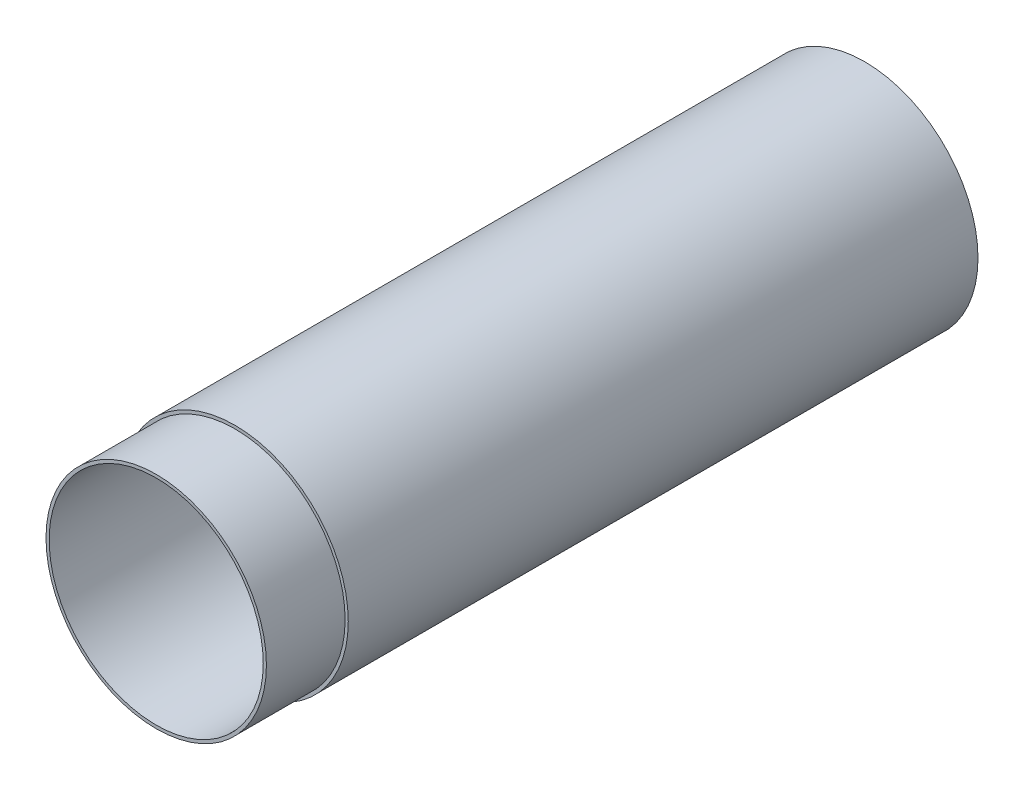
ISO-10303-21;
HEADER;
FILE_DESCRIPTION(('STEP AP214'),'2;1');
FILE_NAME('part.step','',(''),(''),'','','');
FILE_SCHEMA(('AUTOMOTIVE_DESIGN { 1 0 10303 214 1 1 1 1 }'));
ENDSEC;
DATA;
#1=APPLICATION_CONTEXT('core data for automotive mechanical design processes');
#2=APPLICATION_PROTOCOL_DEFINITION('international standard','automotive_design',2000,#1);
#3=PRODUCT_CONTEXT('',#1,'mechanical');
#4=PRODUCT('Part','Part','',(#3));
#5=PRODUCT_RELATED_PRODUCT_CATEGORY('part','',(#4));
#6=PRODUCT_DEFINITION_FORMATION('','',#4);
#7=PRODUCT_DEFINITION_CONTEXT('part definition',#1,'design');
#8=PRODUCT_DEFINITION('design','',#6,#7);
#9=PRODUCT_DEFINITION_SHAPE('','',#8);
#10=(LENGTH_UNIT() NAMED_UNIT(*) SI_UNIT(.MILLI.,.METRE.));
#11=(NAMED_UNIT(*) PLANE_ANGLE_UNIT() SI_UNIT($,.RADIAN.));
#12=(NAMED_UNIT(*) SI_UNIT($,.STERADIAN.) SOLID_ANGLE_UNIT());
#13=UNCERTAINTY_MEASURE_WITH_UNIT(LENGTH_MEASURE(1.E-05),#10,'distance_accuracy_value','');
#14=(GEOMETRIC_REPRESENTATION_CONTEXT(3) GLOBAL_UNCERTAINTY_ASSIGNED_CONTEXT((#13)) GLOBAL_UNIT_ASSIGNED_CONTEXT((#10,
#11,#12)) REPRESENTATION_CONTEXT('',''));
#15=CARTESIAN_POINT('',(0.,0.,0.));
#16=DIRECTION('',(0.,0.,1.));
#17=DIRECTION('',(1.,0.,0.));
#18=AXIS2_PLACEMENT_3D('',#15,#16,#17);
#19=CARTESIAN_POINT('',(0.,0.,225.));
#20=DIRECTION('',(0.,0.,1.));
#21=DIRECTION('',(1.,0.,0.));
#22=AXIS2_PLACEMENT_3D('',#19,#20,#21);
#23=PLANE('',#22);
#24=CARTESIAN_POINT('',(0.,0.,225.));
#25=DIRECTION('',(0.,0.,1.));
#26=DIRECTION('',(1.,0.,0.));
#27=AXIS2_PLACEMENT_3D('',#24,#25,#26);
#28=CIRCLE('',#27,34.);
#29=CARTESIAN_POINT('',(34.,0.,225.));
#30=VERTEX_POINT('',#29);
#31=EDGE_CURVE('E38',#30,#30,#28,.T.);
#32=ORIENTED_EDGE('',*,*,#31,.F.);
#33=EDGE_LOOP('',(#32));
#34=FACE_BOUND('',#33,.T.);
#35=CARTESIAN_POINT('',(0.,0.,225.));
#36=DIRECTION('',(0.,0.,1.));
#37=DIRECTION('',(1.,0.,0.));
#38=AXIS2_PLACEMENT_3D('',#35,#36,#37);
#39=CIRCLE('',#38,35.);
#40=CARTESIAN_POINT('',(35.,0.,225.));
#41=VERTEX_POINT('',#40);
#42=EDGE_CURVE('E52',#41,#41,#39,.T.);
#43=ORIENTED_EDGE('',*,*,#42,.T.);
#44=EDGE_LOOP('',(#43));
#45=FACE_BOUND('',#44,.T.);
#46=ADVANCED_FACE('F31',(#34,#45),#23,.T.);
#47=CARTESIAN_POINT('',(0.,0.,225.));
#48=DIRECTION('',(0.,0.,-1.));
#49=DIRECTION('',(-1.,0.,0.));
#50=AXIS2_PLACEMENT_3D('',#47,#48,#49);
#51=CYLINDRICAL_SURFACE('',#50,36.);
#52=CARTESIAN_POINT('',(0.,0.,0.));
#53=DIRECTION('',(0.,0.,1.));
#54=DIRECTION('',(1.,0.,0.));
#55=AXIS2_PLACEMENT_3D('',#52,#53,#54);
#56=CIRCLE('',#55,36.);
#57=CARTESIAN_POINT('',(36.,0.,0.));
#58=VERTEX_POINT('',#57);
#59=EDGE_CURVE('E10',#58,#58,#56,.T.);
#60=ORIENTED_EDGE('',*,*,#59,.T.);
#61=EDGE_LOOP('',(#60));
#62=FACE_BOUND('',#61,.T.);
#63=CARTESIAN_POINT('',(0.,0.,200.));
#64=DIRECTION('',(0.,0.,1.));
#65=DIRECTION('',(1.,0.,0.));
#66=AXIS2_PLACEMENT_3D('',#63,#64,#65);
#67=CIRCLE('',#66,36.);
#68=CARTESIAN_POINT('',(36.,0.,200.));
#69=VERTEX_POINT('',#68);
#70=EDGE_CURVE('E47',#69,#69,#67,.T.);
#71=ORIENTED_EDGE('',*,*,#70,.F.);
#72=EDGE_LOOP('',(#71));
#73=FACE_BOUND('',#72,.T.);
#74=ADVANCED_FACE('F33',(#62,#73),#51,.T.);
#75=CARTESIAN_POINT('',(0.,0.,0.));
#76=DIRECTION('',(0.,0.,1.));
#77=DIRECTION('',(1.,0.,0.));
#78=AXIS2_PLACEMENT_3D('',#75,#76,#77);
#79=PLANE('',#78);
#80=ORIENTED_EDGE('',*,*,#59,.F.);
#81=EDGE_LOOP('',(#80));
#82=FACE_BOUND('',#81,.T.);
#83=CARTESIAN_POINT('',(0.,0.,0.));
#84=DIRECTION('',(0.,0.,1.));
#85=DIRECTION('',(1.,0.,0.));
#86=AXIS2_PLACEMENT_3D('',#83,#84,#85);
#87=CIRCLE('',#86,34.);
#88=CARTESIAN_POINT('',(34.,0.,0.));
#89=VERTEX_POINT('',#88);
#90=EDGE_CURVE('E42',#89,#89,#87,.T.);
#91=ORIENTED_EDGE('',*,*,#90,.T.);
#92=EDGE_LOOP('',(#91));
#93=FACE_BOUND('',#92,.T.);
#94=ADVANCED_FACE('F69',(#82,#93),#79,.F.);
#95=CARTESIAN_POINT('',(0.,0.,225.));
#96=DIRECTION('',(0.,0.,-1.));
#97=DIRECTION('',(-1.,0.,0.));
#98=AXIS2_PLACEMENT_3D('',#95,#96,#97);
#99=CYLINDRICAL_SURFACE('',#98,34.);
#100=ORIENTED_EDGE('',*,*,#31,.T.);
#101=EDGE_LOOP('',(#100));
#102=FACE_BOUND('',#101,.T.);
#103=ORIENTED_EDGE('',*,*,#90,.F.);
#104=EDGE_LOOP('',(#103));
#105=FACE_BOUND('',#104,.T.);
#106=ADVANCED_FACE('F64',(#102,#105),#99,.F.);
#107=CARTESIAN_POINT('',(0.,0.,200.));
#108=DIRECTION('',(0.,0.,1.));
#109=DIRECTION('',(1.,0.,0.));
#110=AXIS2_PLACEMENT_3D('',#107,#108,#109);
#111=PLANE('',#110);
#112=CARTESIAN_POINT('',(0.,0.,200.));
#113=DIRECTION('',(0.,0.,1.));
#114=DIRECTION('',(1.,0.,0.));
#115=AXIS2_PLACEMENT_3D('',#112,#113,#114);
#116=CIRCLE('',#115,35.);
#117=CARTESIAN_POINT('',(35.,0.,200.));
#118=VERTEX_POINT('',#117);
#119=EDGE_CURVE('E51',#118,#118,#116,.T.);
#120=ORIENTED_EDGE('',*,*,#119,.F.);
#121=EDGE_LOOP('',(#120));
#122=FACE_BOUND('',#121,.T.);
#123=ORIENTED_EDGE('',*,*,#70,.T.);
#124=EDGE_LOOP('',(#123));
#125=FACE_BOUND('',#124,.T.);
#126=ADVANCED_FACE('F61',(#122,#125),#111,.T.);
#127=CARTESIAN_POINT('',(0.,0.,200.));
#128=DIRECTION('',(0.,0.,1.));
#129=DIRECTION('',(1.,0.,0.));
#130=AXIS2_PLACEMENT_3D('',#127,#128,#129);
#131=CYLINDRICAL_SURFACE('',#130,35.);
#132=ORIENTED_EDGE('',*,*,#119,.T.);
#133=EDGE_LOOP('',(#132));
#134=FACE_BOUND('',#133,.T.);
#135=ORIENTED_EDGE('',*,*,#42,.F.);
#136=EDGE_LOOP('',(#135));
#137=FACE_BOUND('',#136,.T.);
#138=ADVANCED_FACE('F58',(#134,#137),#131,.T.);
#139=CLOSED_SHELL('',(#46,#74,#94,#106,#126,#138));
#140=MANIFOLD_SOLID_BREP('B2',#139);
#141=ADVANCED_BREP_SHAPE_REPRESENTATION('',(#18,#140),#14);
#142=SHAPE_DEFINITION_REPRESENTATION(#9,#141);
ENDSEC;
END-ISO-10303-21;
